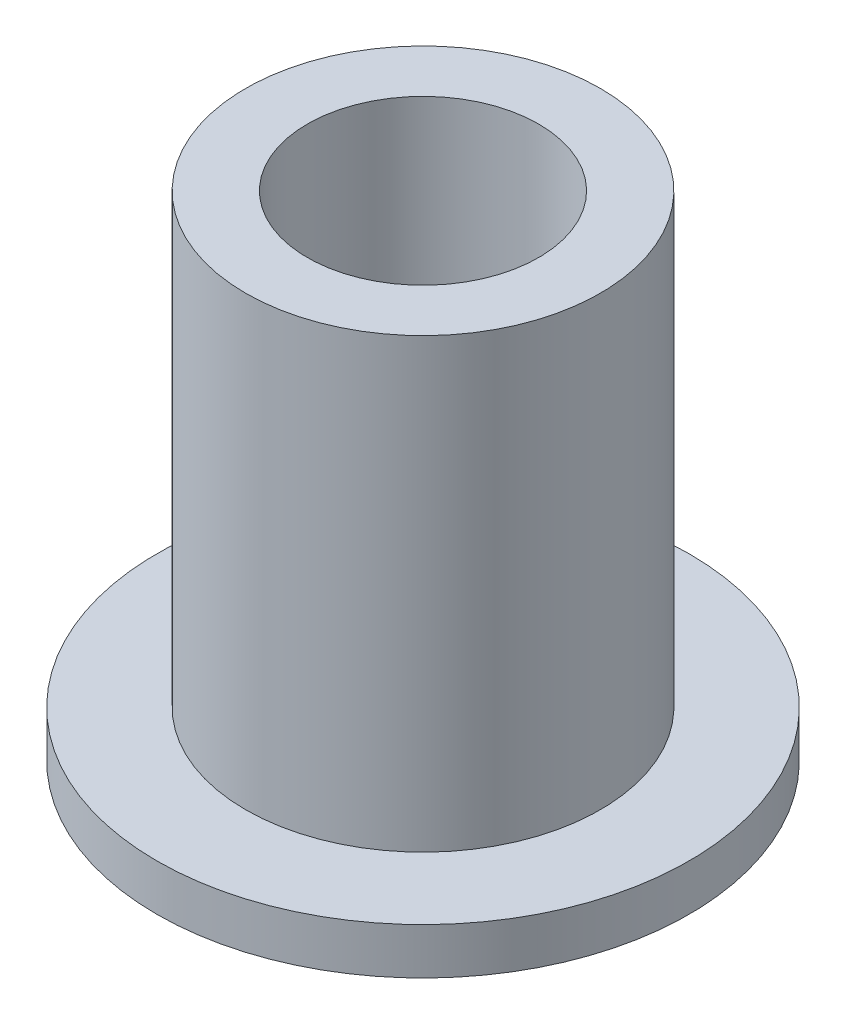
ISO-10303-21;
HEADER;
FILE_DESCRIPTION(('STEP AP214'),'2;1');
FILE_NAME('part.step','',(''),(''),'','','');
FILE_SCHEMA(('AUTOMOTIVE_DESIGN { 1 0 10303 214 1 1 1 1 }'));
ENDSEC;
DATA;
#1=APPLICATION_CONTEXT('core data for automotive mechanical design processes');
#2=APPLICATION_PROTOCOL_DEFINITION('international standard','automotive_design',2000,#1);
#3=PRODUCT_CONTEXT('',#1,'mechanical');
#4=PRODUCT('Part','Part','',(#3));
#5=PRODUCT_RELATED_PRODUCT_CATEGORY('part','',(#4));
#6=PRODUCT_DEFINITION_FORMATION('','',#4);
#7=PRODUCT_DEFINITION_CONTEXT('part definition',#1,'design');
#8=PRODUCT_DEFINITION('design','',#6,#7);
#9=PRODUCT_DEFINITION_SHAPE('','',#8);
#10=(LENGTH_UNIT() NAMED_UNIT(*) SI_UNIT(.MILLI.,.METRE.));
#11=(NAMED_UNIT(*) PLANE_ANGLE_UNIT() SI_UNIT($,.RADIAN.));
#12=(NAMED_UNIT(*) SI_UNIT($,.STERADIAN.) SOLID_ANGLE_UNIT());
#13=UNCERTAINTY_MEASURE_WITH_UNIT(LENGTH_MEASURE(1.E-05),#10,'distance_accuracy_value','');
#14=(GEOMETRIC_REPRESENTATION_CONTEXT(3) GLOBAL_UNCERTAINTY_ASSIGNED_CONTEXT((#13)) GLOBAL_UNIT_ASSIGNED_CONTEXT((#10,
#11,#12)) REPRESENTATION_CONTEXT('',''));
#15=CARTESIAN_POINT('',(0.,0.,0.));
#16=DIRECTION('',(0.,0.,1.));
#17=DIRECTION('',(1.,0.,0.));
#18=AXIS2_PLACEMENT_3D('',#15,#16,#17);
#19=CARTESIAN_POINT('',(0.,0.,0.));
#20=DIRECTION('',(0.,-1.,0.));
#21=DIRECTION('',(0.,0.,-1.));
#22=AXIS2_PLACEMENT_3D('',#19,#20,#21);
#23=CYLINDRICAL_SURFACE('',#22,1.5);
#24=CARTESIAN_POINT('',(0.,0.,0.));
#25=DIRECTION('',(0.,-1.,0.));
#26=DIRECTION('',(0.,0.,-1.));
#27=AXIS2_PLACEMENT_3D('',#24,#25,#26);
#28=CIRCLE('',#27,1.5);
#29=CARTESIAN_POINT('',(0.,0.,-1.5));
#30=VERTEX_POINT('',#29);
#31=EDGE_CURVE('E10',#30,#30,#28,.T.);
#32=ORIENTED_EDGE('',*,*,#31,.T.);
#33=EDGE_LOOP('',(#32));
#34=FACE_BOUND('',#33,.T.);
#35=CARTESIAN_POINT('',(0.,6.4,0.));
#36=DIRECTION('',(0.,-1.,0.));
#37=DIRECTION('',(0.,0.,-1.));
#38=AXIS2_PLACEMENT_3D('',#35,#36,#37);
#39=CIRCLE('',#38,1.5);
#40=CARTESIAN_POINT('',(0.,6.4,-1.5));
#41=VERTEX_POINT('',#40);
#42=EDGE_CURVE('E56',#41,#41,#39,.T.);
#43=ORIENTED_EDGE('',*,*,#42,.F.);
#44=EDGE_LOOP('',(#43));
#45=FACE_BOUND('',#44,.T.);
#46=ADVANCED_FACE('F34',(#34,#45),#23,.F.);
#47=CARTESIAN_POINT('',(1.5,0.,0.));
#48=DIRECTION('',(0.,-1.,0.));
#49=DIRECTION('',(0.,0.,-1.));
#50=AXIS2_PLACEMENT_3D('',#47,#48,#49);
#51=PLANE('',#50);
#52=CARTESIAN_POINT('',(0.,0.,0.));
#53=DIRECTION('',(0.,-1.,0.));
#54=DIRECTION('',(0.,0.,-1.));
#55=AXIS2_PLACEMENT_3D('',#52,#53,#54);
#56=CIRCLE('',#55,3.45);
#57=CARTESIAN_POINT('',(0.,0.,-3.45));
#58=VERTEX_POINT('',#57);
#59=EDGE_CURVE('E40',#58,#58,#56,.T.);
#60=ORIENTED_EDGE('',*,*,#59,.T.);
#61=EDGE_LOOP('',(#60));
#62=FACE_BOUND('',#61,.T.);
#63=ORIENTED_EDGE('',*,*,#31,.F.);
#64=EDGE_LOOP('',(#63));
#65=FACE_BOUND('',#64,.T.);
#66=ADVANCED_FACE('F64',(#62,#65),#51,.T.);
#67=CARTESIAN_POINT('',(0.,0.,0.));
#68=DIRECTION('',(0.,-1.,0.));
#69=DIRECTION('',(0.,0.,-1.));
#70=AXIS2_PLACEMENT_3D('',#67,#68,#69);
#71=CYLINDRICAL_SURFACE('',#70,3.45);
#72=CARTESIAN_POINT('',(0.,0.6,0.));
#73=DIRECTION('',(0.,-1.,0.));
#74=DIRECTION('',(0.,0.,-1.));
#75=AXIS2_PLACEMENT_3D('',#72,#73,#74);
#76=CIRCLE('',#75,3.45);
#77=CARTESIAN_POINT('',(0.,0.6,-3.45));
#78=VERTEX_POINT('',#77);
#79=EDGE_CURVE('E44',#78,#78,#76,.T.);
#80=ORIENTED_EDGE('',*,*,#79,.T.);
#81=EDGE_LOOP('',(#80));
#82=FACE_BOUND('',#81,.T.);
#83=ORIENTED_EDGE('',*,*,#59,.F.);
#84=EDGE_LOOP('',(#83));
#85=FACE_BOUND('',#84,.T.);
#86=ADVANCED_FACE('F68',(#82,#85),#71,.T.);
#87=CARTESIAN_POINT('',(3.45,0.6,0.));
#88=DIRECTION('',(0.,1.,0.));
#89=DIRECTION('',(0.,0.,1.));
#90=AXIS2_PLACEMENT_3D('',#87,#88,#89);
#91=PLANE('',#90);
#92=CARTESIAN_POINT('',(0.,0.6,0.));
#93=DIRECTION('',(0.,-1.,0.));
#94=DIRECTION('',(0.,0.,-1.));
#95=AXIS2_PLACEMENT_3D('',#92,#93,#94);
#96=CIRCLE('',#95,2.3);
#97=CARTESIAN_POINT('',(0.,0.6,-2.3));
#98=VERTEX_POINT('',#97);
#99=EDGE_CURVE('E48',#98,#98,#96,.T.);
#100=ORIENTED_EDGE('',*,*,#99,.T.);
#101=EDGE_LOOP('',(#100));
#102=FACE_BOUND('',#101,.T.);
#103=ORIENTED_EDGE('',*,*,#79,.F.);
#104=EDGE_LOOP('',(#103));
#105=FACE_BOUND('',#104,.T.);
#106=ADVANCED_FACE('F72',(#102,#105),#91,.T.);
#107=CARTESIAN_POINT('',(0.,0.,0.));
#108=DIRECTION('',(0.,-1.,0.));
#109=DIRECTION('',(0.,0.,-1.));
#110=AXIS2_PLACEMENT_3D('',#107,#108,#109);
#111=CYLINDRICAL_SURFACE('',#110,2.3);
#112=CARTESIAN_POINT('',(0.,6.4,0.));
#113=DIRECTION('',(0.,-1.,0.));
#114=DIRECTION('',(0.,0.,-1.));
#115=AXIS2_PLACEMENT_3D('',#112,#113,#114);
#116=CIRCLE('',#115,2.3);
#117=CARTESIAN_POINT('',(0.,6.4,-2.3));
#118=VERTEX_POINT('',#117);
#119=EDGE_CURVE('E53',#118,#118,#116,.T.);
#120=ORIENTED_EDGE('',*,*,#119,.T.);
#121=EDGE_LOOP('',(#120));
#122=FACE_BOUND('',#121,.T.);
#123=ORIENTED_EDGE('',*,*,#99,.F.);
#124=EDGE_LOOP('',(#123));
#125=FACE_BOUND('',#124,.T.);
#126=ADVANCED_FACE('F79',(#122,#125),#111,.T.);
#127=CARTESIAN_POINT('',(2.3,6.4,0.));
#128=DIRECTION('',(0.,1.,0.));
#129=DIRECTION('',(0.,0.,1.));
#130=AXIS2_PLACEMENT_3D('',#127,#128,#129);
#131=PLANE('',#130);
#132=ORIENTED_EDGE('',*,*,#42,.T.);
#133=EDGE_LOOP('',(#132));
#134=FACE_BOUND('',#133,.T.);
#135=ORIENTED_EDGE('',*,*,#119,.F.);
#136=EDGE_LOOP('',(#135));
#137=FACE_BOUND('',#136,.T.);
#138=ADVANCED_FACE('F60',(#134,#137),#131,.T.);
#139=CLOSED_SHELL('',(#46,#66,#86,#106,#126,#138));
#140=MANIFOLD_SOLID_BREP('B2',#139);
#141=ADVANCED_BREP_SHAPE_REPRESENTATION('',(#18,#140),#14);
#142=SHAPE_DEFINITION_REPRESENTATION(#9,#141);
ENDSEC;
END-ISO-10303-21;
